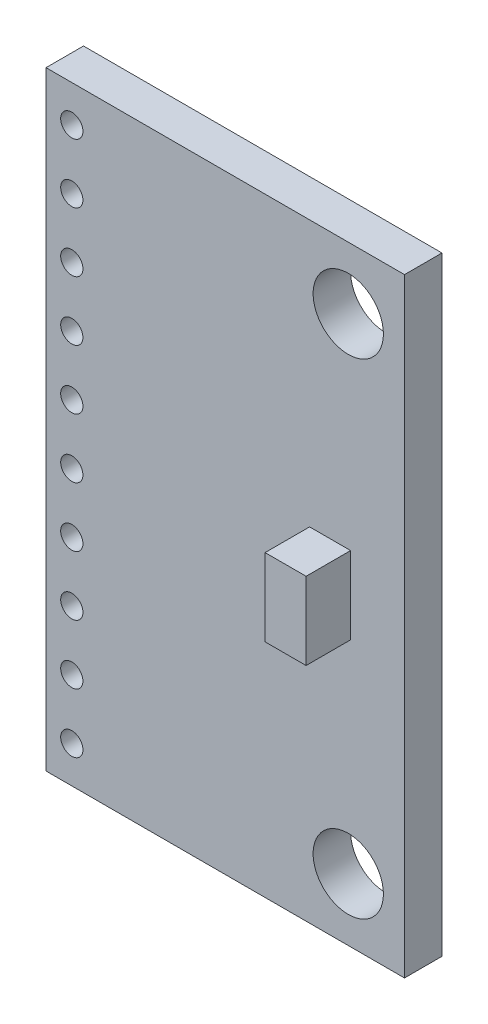
ISO-10303-21;
HEADER;
FILE_DESCRIPTION(('STEP AP214'),'2;1');
FILE_NAME('part.step','',(''),(''),'','','');
FILE_SCHEMA(('AUTOMOTIVE_DESIGN { 1 0 10303 214 1 1 1 1 }'));
ENDSEC;
DATA;
#1=APPLICATION_CONTEXT('core data for automotive mechanical design processes');
#2=APPLICATION_PROTOCOL_DEFINITION('international standard','automotive_design',2000,#1);
#3=PRODUCT_CONTEXT('',#1,'mechanical');
#4=PRODUCT('Part','Part','',(#3));
#5=PRODUCT_RELATED_PRODUCT_CATEGORY('part','',(#4));
#6=PRODUCT_DEFINITION_FORMATION('','',#4);
#7=PRODUCT_DEFINITION_CONTEXT('part definition',#1,'design');
#8=PRODUCT_DEFINITION('design','',#6,#7);
#9=PRODUCT_DEFINITION_SHAPE('','',#8);
#10=(LENGTH_UNIT() NAMED_UNIT(*) SI_UNIT(.MILLI.,.METRE.));
#11=(NAMED_UNIT(*) PLANE_ANGLE_UNIT() SI_UNIT($,.RADIAN.));
#12=(NAMED_UNIT(*) SI_UNIT($,.STERADIAN.) SOLID_ANGLE_UNIT());
#13=UNCERTAINTY_MEASURE_WITH_UNIT(LENGTH_MEASURE(1.E-05),#10,'distance_accuracy_value','');
#14=(GEOMETRIC_REPRESENTATION_CONTEXT(3) GLOBAL_UNCERTAINTY_ASSIGNED_CONTEXT((#13)) GLOBAL_UNIT_ASSIGNED_CONTEXT((#10,
#11,#12)) REPRESENTATION_CONTEXT('',''));
#15=CARTESIAN_POINT('',(0.,0.,0.));
#16=DIRECTION('',(0.,0.,1.));
#17=DIRECTION('',(1.,0.,0.));
#18=AXIS2_PLACEMENT_3D('',#15,#16,#17);
#19=CARTESIAN_POINT('',(0.,0.,0.));
#20=DIRECTION('',(0.,0.,1.));
#21=DIRECTION('',(1.,0.,0.));
#22=AXIS2_PLACEMENT_3D('',#19,#20,#21);
#23=PLANE('',#22);
#24=CARTESIAN_POINT('',(-6.55,-11.43,0.));
#25=DIRECTION('',(0.,0.,-1.));
#26=DIRECTION('',(1.,0.,0.));
#27=AXIS2_PLACEMENT_3D('',#24,#25,#26);
#28=CIRCLE('',#27,0.475);
#29=CARTESIAN_POINT('',(-6.075,-11.43,0.));
#30=VERTEX_POINT('',#29);
#31=EDGE_CURVE('E202',#30,#30,#28,.T.);
#32=ORIENTED_EDGE('',*,*,#31,.T.);
#33=EDGE_LOOP('',(#32));
#34=FACE_BOUND('',#33,.T.);
#35=CARTESIAN_POINT('',(-6.55,-6.35,0.));
#36=DIRECTION('',(0.,0.,-1.));
#37=DIRECTION('',(1.,0.,0.));
#38=AXIS2_PLACEMENT_3D('',#35,#36,#37);
#39=CIRCLE('',#38,0.475);
#40=CARTESIAN_POINT('',(-6.075,-6.35,0.));
#41=VERTEX_POINT('',#40);
#42=EDGE_CURVE('E210',#41,#41,#39,.T.);
#43=ORIENTED_EDGE('',*,*,#42,.T.);
#44=EDGE_LOOP('',(#43));
#45=FACE_BOUND('',#44,.T.);
#46=CARTESIAN_POINT('',(-6.55,3.81,0.));
#47=DIRECTION('',(0.,0.,1.));
#48=DIRECTION('',(1.,0.,0.));
#49=AXIS2_PLACEMENT_3D('',#46,#47,#48);
#50=CIRCLE('',#49,0.475);
#51=CARTESIAN_POINT('',(-6.075,3.81,0.));
#52=VERTEX_POINT('',#51);
#53=EDGE_CURVE('E219',#52,#52,#50,.T.);
#54=ORIENTED_EDGE('',*,*,#53,.F.);
#55=EDGE_LOOP('',(#54));
#56=FACE_BOUND('',#55,.T.);
#57=CARTESIAN_POINT('',(-6.55,6.35,0.));
#58=DIRECTION('',(0.,0.,1.));
#59=DIRECTION('',(1.,0.,0.));
#60=AXIS2_PLACEMENT_3D('',#57,#58,#59);
#61=CIRCLE('',#60,0.475);
#62=CARTESIAN_POINT('',(-6.075,6.35,0.));
#63=VERTEX_POINT('',#62);
#64=EDGE_CURVE('E227',#63,#63,#61,.T.);
#65=ORIENTED_EDGE('',*,*,#64,.F.);
#66=EDGE_LOOP('',(#65));
#67=FACE_BOUND('',#66,.T.);
#68=CARTESIAN_POINT('',(-6.55,8.89,0.));
#69=DIRECTION('',(0.,0.,1.));
#70=DIRECTION('',(1.,0.,0.));
#71=AXIS2_PLACEMENT_3D('',#68,#69,#70);
#72=CIRCLE('',#71,0.475);
#73=CARTESIAN_POINT('',(-6.075,8.89,0.));
#74=VERTEX_POINT('',#73);
#75=EDGE_CURVE('E233',#74,#74,#72,.T.);
#76=ORIENTED_EDGE('',*,*,#75,.F.);
#77=EDGE_LOOP('',(#76));
#78=FACE_BOUND('',#77,.T.);
#79=CARTESIAN_POINT('',(-6.55,11.43,0.));
#80=DIRECTION('',(0.,0.,1.));
#81=DIRECTION('',(1.,0.,0.));
#82=AXIS2_PLACEMENT_3D('',#79,#80,#81);
#83=CIRCLE('',#82,0.475);
#84=CARTESIAN_POINT('',(-6.075,11.43,0.));
#85=VERTEX_POINT('',#84);
#86=EDGE_CURVE('E217',#85,#85,#83,.T.);
#87=ORIENTED_EDGE('',*,*,#86,.F.);
#88=EDGE_LOOP('',(#87));
#89=FACE_BOUND('',#88,.T.);
#90=CARTESIAN_POINT('',(-6.55,1.27,0.));
#91=DIRECTION('',(0.,0.,1.));
#92=DIRECTION('',(1.,0.,0.));
#93=AXIS2_PLACEMENT_3D('',#90,#91,#92);
#94=CIRCLE('',#93,0.475);
#95=CARTESIAN_POINT('',(-6.075,1.27,0.));
#96=VERTEX_POINT('',#95);
#97=EDGE_CURVE('E243',#96,#96,#94,.T.);
#98=ORIENTED_EDGE('',*,*,#97,.F.);
#99=EDGE_LOOP('',(#98));
#100=FACE_BOUND('',#99,.T.);
#101=CARTESIAN_POINT('',(-6.55,-1.27,0.));
#102=DIRECTION('',(0.,0.,1.));
#103=DIRECTION('',(1.,0.,0.));
#104=AXIS2_PLACEMENT_3D('',#101,#102,#103);
#105=CIRCLE('',#104,0.475);
#106=CARTESIAN_POINT('',(-6.075,-1.27,0.));
#107=VERTEX_POINT('',#106);
#108=EDGE_CURVE('E226',#107,#107,#105,.T.);
#109=ORIENTED_EDGE('',*,*,#108,.F.);
#110=EDGE_LOOP('',(#109));
#111=FACE_BOUND('',#110,.T.);
#112=CARTESIAN_POINT('',(5.25000000000001,-10.35,0.));
#113=DIRECTION('',(0.,0.,1.));
#114=DIRECTION('',(1.,0.,0.));
#115=AXIS2_PLACEMENT_3D('',#112,#113,#114);
#116=CIRCLE('',#115,1.5);
#117=CARTESIAN_POINT('',(6.75000000000001,-10.35,0.));
#118=VERTEX_POINT('',#117);
#119=EDGE_CURVE('E140',#118,#118,#116,.T.);
#120=ORIENTED_EDGE('',*,*,#119,.F.);
#121=EDGE_LOOP('',(#120));
#122=FACE_BOUND('',#121,.T.);
#123=CARTESIAN_POINT('',(5.25000000000001,10.35,0.));
#124=DIRECTION('',(0.,0.,1.));
#125=DIRECTION('',(1.,0.,0.));
#126=AXIS2_PLACEMENT_3D('',#123,#124,#125);
#127=CIRCLE('',#126,1.5);
#128=CARTESIAN_POINT('',(6.75000000000001,10.35,0.));
#129=VERTEX_POINT('',#128);
#130=EDGE_CURVE('E132',#129,#129,#127,.T.);
#131=ORIENTED_EDGE('',*,*,#130,.F.);
#132=EDGE_LOOP('',(#131));
#133=FACE_BOUND('',#132,.T.);
#134=DIRECTION('',(0.,-1.,0.));
#135=VECTOR('',#134,1.);
#136=CARTESIAN_POINT('',(-7.65,13.,0.));
#137=LINE('',#136,#135);
#138=CARTESIAN_POINT('',(-7.65,13.,0.));
#139=VERTEX_POINT('',#138);
#140=CARTESIAN_POINT('',(-7.65,-13.,0.));
#141=VERTEX_POINT('',#140);
#142=EDGE_CURVE('E145',#139,#141,#137,.T.);
#143=ORIENTED_EDGE('',*,*,#142,.T.);
#144=DIRECTION('',(1.,0.,0.));
#145=VECTOR('',#144,1.);
#146=CARTESIAN_POINT('',(-7.65,-13.,0.));
#147=LINE('',#146,#145);
#148=CARTESIAN_POINT('',(7.65000000000001,-13.,0.));
#149=VERTEX_POINT('',#148);
#150=EDGE_CURVE('E161',#141,#149,#147,.T.);
#151=ORIENTED_EDGE('',*,*,#150,.T.);
#152=DIRECTION('',(0.,1.,0.));
#153=VECTOR('',#152,1.);
#154=CARTESIAN_POINT('',(7.65,13.,0.));
#155=LINE('',#154,#153);
#156=CARTESIAN_POINT('',(7.65,13.,0.));
#157=VERTEX_POINT('',#156);
#158=EDGE_CURVE('E164',#149,#157,#155,.T.);
#159=ORIENTED_EDGE('',*,*,#158,.T.);
#160=DIRECTION('',(-1.,0.,0.));
#161=VECTOR('',#160,1.);
#162=CARTESIAN_POINT('',(-7.65,13.,0.));
#163=LINE('',#162,#161);
#164=EDGE_CURVE('E152',#157,#139,#163,.T.);
#165=ORIENTED_EDGE('',*,*,#164,.T.);
#166=EDGE_LOOP('',(#143,#151,#159,#165));
#167=FACE_BOUND('',#166,.T.);
#168=DIRECTION('',(1.,0.,0.));
#169=VECTOR('',#168,1.);
#170=CARTESIAN_POINT('',(3.60000000000001,-1.65,0.));
#171=LINE('',#170,#169);
#172=CARTESIAN_POINT('',(3.60000000000001,-1.65,0.));
#173=VERTEX_POINT('',#172);
#174=CARTESIAN_POINT('',(5.35000000000001,-1.65,0.));
#175=VERTEX_POINT('',#174);
#176=EDGE_CURVE('E258',#173,#175,#171,.T.);
#177=ORIENTED_EDGE('',*,*,#176,.F.);
#178=DIRECTION('',(0.,-1.,0.));
#179=VECTOR('',#178,1.);
#180=CARTESIAN_POINT('',(3.60000000000001,1.65,0.));
#181=LINE('',#180,#179);
#182=CARTESIAN_POINT('',(3.60000000000001,1.65,0.));
#183=VERTEX_POINT('',#182);
#184=EDGE_CURVE('E130',#183,#173,#181,.T.);
#185=ORIENTED_EDGE('',*,*,#184,.F.);
#186=DIRECTION('',(-1.,0.,0.));
#187=VECTOR('',#186,1.);
#188=CARTESIAN_POINT('',(3.60000000000001,1.65,0.));
#189=LINE('',#188,#187);
#190=CARTESIAN_POINT('',(5.35000000000001,1.65,0.));
#191=VERTEX_POINT('',#190);
#192=EDGE_CURVE('E126',#191,#183,#189,.T.);
#193=ORIENTED_EDGE('',*,*,#192,.F.);
#194=DIRECTION('',(0.,1.,0.));
#195=VECTOR('',#194,1.);
#196=CARTESIAN_POINT('',(5.35000000000001,1.65,0.));
#197=LINE('',#196,#195);
#198=EDGE_CURVE('E260',#175,#191,#197,.T.);
#199=ORIENTED_EDGE('',*,*,#198,.F.);
#200=EDGE_LOOP('',(#177,#185,#193,#199));
#201=FACE_BOUND('',#200,.T.);
#202=CARTESIAN_POINT('',(-6.55,-3.81,0.));
#203=DIRECTION('',(0.,0.,-1.));
#204=DIRECTION('',(1.,0.,0.));
#205=AXIS2_PLACEMENT_3D('',#202,#203,#204);
#206=CIRCLE('',#205,0.475);
#207=CARTESIAN_POINT('',(-6.075,-3.81,0.));
#208=VERTEX_POINT('',#207);
#209=EDGE_CURVE('E214',#208,#208,#206,.T.);
#210=ORIENTED_EDGE('',*,*,#209,.T.);
#211=EDGE_LOOP('',(#210));
#212=FACE_BOUND('',#211,.T.);
#213=CARTESIAN_POINT('',(-6.55,-8.89,0.));
#214=DIRECTION('',(0.,0.,-1.));
#215=DIRECTION('',(1.,0.,0.));
#216=AXIS2_PLACEMENT_3D('',#213,#214,#215);
#217=CIRCLE('',#216,0.475);
#218=CARTESIAN_POINT('',(-6.075,-8.89,0.));
#219=VERTEX_POINT('',#218);
#220=EDGE_CURVE('E201',#219,#219,#217,.T.);
#221=ORIENTED_EDGE('',*,*,#220,.T.);
#222=EDGE_LOOP('',(#221));
#223=FACE_BOUND('',#222,.T.);
#224=ADVANCED_FACE('F34',(#34,#45,#56,#67,#78,#89,#100,#111,#122,#133,#167,#201,#212,#223),#23,.T.);
#225=CARTESIAN_POINT('',(0.,0.,-1.6));
#226=DIRECTION('',(0.,0.,1.));
#227=DIRECTION('',(1.,0.,0.));
#228=AXIS2_PLACEMENT_3D('',#225,#226,#227);
#229=PLANE('',#228);
#230=CARTESIAN_POINT('',(-6.55,3.81,-1.6));
#231=DIRECTION('',(0.,0.,1.));
#232=DIRECTION('',(1.,0.,0.));
#233=AXIS2_PLACEMENT_3D('',#230,#231,#232);
#234=CIRCLE('',#233,0.475);
#235=CARTESIAN_POINT('',(-6.075,3.81,-1.6));
#236=VERTEX_POINT('',#235);
#237=EDGE_CURVE('E222',#236,#236,#234,.F.);
#238=ORIENTED_EDGE('',*,*,#237,.F.);
#239=EDGE_LOOP('',(#238));
#240=FACE_BOUND('',#239,.T.);
#241=CARTESIAN_POINT('',(-6.55,6.35,-1.6));
#242=DIRECTION('',(0.,0.,1.));
#243=DIRECTION('',(1.,0.,0.));
#244=AXIS2_PLACEMENT_3D('',#241,#242,#243);
#245=CIRCLE('',#244,0.475);
#246=CARTESIAN_POINT('',(-6.075,6.35,-1.6));
#247=VERTEX_POINT('',#246);
#248=EDGE_CURVE('E223',#247,#247,#245,.F.);
#249=ORIENTED_EDGE('',*,*,#248,.F.);
#250=EDGE_LOOP('',(#249));
#251=FACE_BOUND('',#250,.T.);
#252=CARTESIAN_POINT('',(-6.55,8.89,-1.6));
#253=DIRECTION('',(0.,0.,1.));
#254=DIRECTION('',(1.,0.,0.));
#255=AXIS2_PLACEMENT_3D('',#252,#253,#254);
#256=CIRCLE('',#255,0.475);
#257=CARTESIAN_POINT('',(-6.075,8.89,-1.6));
#258=VERTEX_POINT('',#257);
#259=EDGE_CURVE('E230',#258,#258,#256,.F.);
#260=ORIENTED_EDGE('',*,*,#259,.F.);
#261=EDGE_LOOP('',(#260));
#262=FACE_BOUND('',#261,.T.);
#263=CARTESIAN_POINT('',(-6.55,11.43,-1.6));
#264=DIRECTION('',(0.,0.,1.));
#265=DIRECTION('',(1.,0.,0.));
#266=AXIS2_PLACEMENT_3D('',#263,#264,#265);
#267=CIRCLE('',#266,0.475);
#268=CARTESIAN_POINT('',(-6.075,11.43,-1.6));
#269=VERTEX_POINT('',#268);
#270=EDGE_CURVE('E236',#269,#269,#267,.F.);
#271=ORIENTED_EDGE('',*,*,#270,.F.);
#272=EDGE_LOOP('',(#271));
#273=FACE_BOUND('',#272,.T.);
#274=CARTESIAN_POINT('',(-6.55,1.27,-1.6));
#275=DIRECTION('',(0.,0.,1.));
#276=DIRECTION('',(1.,0.,0.));
#277=AXIS2_PLACEMENT_3D('',#274,#275,#276);
#278=CIRCLE('',#277,0.475);
#279=CARTESIAN_POINT('',(-6.075,1.27,-1.6));
#280=VERTEX_POINT('',#279);
#281=EDGE_CURVE('E246',#280,#280,#278,.F.);
#282=ORIENTED_EDGE('',*,*,#281,.F.);
#283=EDGE_LOOP('',(#282));
#284=FACE_BOUND('',#283,.T.);
#285=CARTESIAN_POINT('',(-6.55,-1.27,-1.6));
#286=DIRECTION('',(0.,0.,1.));
#287=DIRECTION('',(1.,0.,0.));
#288=AXIS2_PLACEMENT_3D('',#285,#286,#287);
#289=CIRCLE('',#288,0.475);
#290=CARTESIAN_POINT('',(-6.075,-1.27,-1.6));
#291=VERTEX_POINT('',#290);
#292=EDGE_CURVE('E247',#291,#291,#289,.F.);
#293=ORIENTED_EDGE('',*,*,#292,.F.);
#294=EDGE_LOOP('',(#293));
#295=FACE_BOUND('',#294,.T.);
#296=CARTESIAN_POINT('',(5.25000000000001,-10.35,-1.6));
#297=DIRECTION('',(0.,0.,1.));
#298=DIRECTION('',(1.,0.,0.));
#299=AXIS2_PLACEMENT_3D('',#296,#297,#298);
#300=CIRCLE('',#299,1.5);
#301=CARTESIAN_POINT('',(6.75000000000001,-10.35,-1.6));
#302=VERTEX_POINT('',#301);
#303=EDGE_CURVE('E143',#302,#302,#300,.F.);
#304=ORIENTED_EDGE('',*,*,#303,.F.);
#305=EDGE_LOOP('',(#304));
#306=FACE_BOUND('',#305,.T.);
#307=CARTESIAN_POINT('',(5.25000000000001,10.35,-1.6));
#308=DIRECTION('',(0.,0.,1.));
#309=DIRECTION('',(1.,0.,0.));
#310=AXIS2_PLACEMENT_3D('',#307,#308,#309);
#311=CIRCLE('',#310,1.5);
#312=CARTESIAN_POINT('',(6.75000000000001,10.35,-1.6));
#313=VERTEX_POINT('',#312);
#314=EDGE_CURVE('E135',#313,#313,#311,.F.);
#315=ORIENTED_EDGE('',*,*,#314,.F.);
#316=EDGE_LOOP('',(#315));
#317=FACE_BOUND('',#316,.T.);
#318=DIRECTION('',(0.,-1.,0.));
#319=VECTOR('',#318,1.);
#320=CARTESIAN_POINT('',(-7.65,13.,-1.6));
#321=LINE('',#320,#319);
#322=CARTESIAN_POINT('',(-7.65,13.,-1.6));
#323=VERTEX_POINT('',#322);
#324=CARTESIAN_POINT('',(-7.65,-13.,-1.6));
#325=VERTEX_POINT('',#324);
#326=EDGE_CURVE('E149',#323,#325,#321,.T.);
#327=ORIENTED_EDGE('',*,*,#326,.F.);
#328=DIRECTION('',(-1.,0.,0.));
#329=VECTOR('',#328,1.);
#330=CARTESIAN_POINT('',(-7.65,13.,-1.6));
#331=LINE('',#330,#329);
#332=CARTESIAN_POINT('',(7.65,13.,-1.6));
#333=VERTEX_POINT('',#332);
#334=EDGE_CURVE('E157',#333,#323,#331,.T.);
#335=ORIENTED_EDGE('',*,*,#334,.F.);
#336=DIRECTION('',(0.,1.,0.));
#337=VECTOR('',#336,1.);
#338=CARTESIAN_POINT('',(7.65,13.,-1.6));
#339=LINE('',#338,#337);
#340=CARTESIAN_POINT('',(7.65000000000001,-13.,-1.6));
#341=VERTEX_POINT('',#340);
#342=EDGE_CURVE('E154',#341,#333,#339,.T.);
#343=ORIENTED_EDGE('',*,*,#342,.F.);
#344=DIRECTION('',(1.,0.,0.));
#345=VECTOR('',#344,1.);
#346=CARTESIAN_POINT('',(-7.65,-13.,-1.6));
#347=LINE('',#346,#345);
#348=EDGE_CURVE('E151',#325,#341,#347,.T.);
#349=ORIENTED_EDGE('',*,*,#348,.F.);
#350=EDGE_LOOP('',(#327,#335,#343,#349));
#351=FACE_BOUND('',#350,.T.);
#352=CARTESIAN_POINT('',(-6.55,-6.35,-1.6));
#353=DIRECTION('',(0.,0.,1.));
#354=DIRECTION('',(1.,0.,0.));
#355=AXIS2_PLACEMENT_3D('',#352,#353,#354);
#356=CIRCLE('',#355,0.475);
#357=CARTESIAN_POINT('',(-6.075,-6.35,-1.6));
#358=VERTEX_POINT('',#357);
#359=EDGE_CURVE('E188',#358,#358,#356,.T.);
#360=ORIENTED_EDGE('',*,*,#359,.T.);
#361=EDGE_LOOP('',(#360));
#362=FACE_BOUND('',#361,.T.);
#363=CARTESIAN_POINT('',(-6.55,-3.81,-1.6));
#364=DIRECTION('',(0.,0.,1.));
#365=DIRECTION('',(1.,0.,0.));
#366=AXIS2_PLACEMENT_3D('',#363,#364,#365);
#367=CIRCLE('',#366,0.475);
#368=CARTESIAN_POINT('',(-6.075,-3.81,-1.6));
#369=VERTEX_POINT('',#368);
#370=EDGE_CURVE('E192',#369,#369,#367,.T.);
#371=ORIENTED_EDGE('',*,*,#370,.T.);
#372=EDGE_LOOP('',(#371));
#373=FACE_BOUND('',#372,.T.);
#374=CARTESIAN_POINT('',(-6.55,-11.43,-1.6));
#375=DIRECTION('',(0.,0.,1.));
#376=DIRECTION('',(1.,0.,0.));
#377=AXIS2_PLACEMENT_3D('',#374,#375,#376);
#378=CIRCLE('',#377,0.475);
#379=CARTESIAN_POINT('',(-6.075,-11.43,-1.6));
#380=VERTEX_POINT('',#379);
#381=EDGE_CURVE('E196',#380,#380,#378,.T.);
#382=ORIENTED_EDGE('',*,*,#381,.T.);
#383=EDGE_LOOP('',(#382));
#384=FACE_BOUND('',#383,.T.);
#385=CARTESIAN_POINT('',(-6.55,-8.89,-1.6));
#386=DIRECTION('',(0.,0.,1.));
#387=DIRECTION('',(1.,0.,0.));
#388=AXIS2_PLACEMENT_3D('',#385,#386,#387);
#389=CIRCLE('',#388,0.475);
#390=CARTESIAN_POINT('',(-6.075,-8.89,-1.6));
#391=VERTEX_POINT('',#390);
#392=EDGE_CURVE('E199',#391,#391,#389,.T.);
#393=ORIENTED_EDGE('',*,*,#392,.T.);
#394=EDGE_LOOP('',(#393));
#395=FACE_BOUND('',#394,.T.);
#396=ADVANCED_FACE('F180',(#240,#251,#262,#273,#284,#295,#306,#317,#351,#362,#373,#384,#395),
#229,.F.);
#397=CARTESIAN_POINT('',(-7.65,13.,-1.6));
#398=DIRECTION('',(-1.,0.,0.));
#399=DIRECTION('',(0.,-1.,0.));
#400=AXIS2_PLACEMENT_3D('',#397,#398,#399);
#401=PLANE('',#400);
#402=ORIENTED_EDGE('',*,*,#142,.F.);
#403=DIRECTION('',(0.,0.,1.));
#404=VECTOR('',#403,1.);
#405=CARTESIAN_POINT('',(-7.65,13.,-1.6));
#406=LINE('',#405,#404);
#407=EDGE_CURVE('E11',#323,#139,#406,.T.);
#408=ORIENTED_EDGE('',*,*,#407,.F.);
#409=ORIENTED_EDGE('',*,*,#326,.T.);
#410=DIRECTION('',(0.,0.,1.));
#411=VECTOR('',#410,1.);
#412=CARTESIAN_POINT('',(-7.65,-13.,-1.6));
#413=LINE('',#412,#411);
#414=EDGE_CURVE('E38',#325,#141,#413,.T.);
#415=ORIENTED_EDGE('',*,*,#414,.T.);
#416=EDGE_LOOP('',(#402,#408,#409,#415));
#417=FACE_BOUND('',#416,.T.);
#418=ADVANCED_FACE('F36',(#417),#401,.T.);
#419=CARTESIAN_POINT('',(-7.65,13.,-1.6));
#420=DIRECTION('',(0.,1.,0.));
#421=DIRECTION('',(-1.,0.,0.));
#422=AXIS2_PLACEMENT_3D('',#419,#420,#421);
#423=PLANE('',#422);
#424=ORIENTED_EDGE('',*,*,#164,.F.);
#425=DIRECTION('',(0.,0.,1.));
#426=VECTOR('',#425,1.);
#427=CARTESIAN_POINT('',(7.65,13.,-1.6));
#428=LINE('',#427,#426);
#429=EDGE_CURVE('E43',#333,#157,#428,.T.);
#430=ORIENTED_EDGE('',*,*,#429,.F.);
#431=ORIENTED_EDGE('',*,*,#334,.T.);
#432=ORIENTED_EDGE('',*,*,#407,.T.);
#433=EDGE_LOOP('',(#424,#430,#431,#432));
#434=FACE_BOUND('',#433,.T.);
#435=ADVANCED_FACE('F174',(#434),#423,.T.);
#436=CARTESIAN_POINT('',(7.65,13.,-1.6));
#437=DIRECTION('',(1.,0.,0.));
#438=DIRECTION('',(0.,1.,0.));
#439=AXIS2_PLACEMENT_3D('',#436,#437,#438);
#440=PLANE('',#439);
#441=ORIENTED_EDGE('',*,*,#158,.F.);
#442=DIRECTION('',(0.,0.,1.));
#443=VECTOR('',#442,1.);
#444=CARTESIAN_POINT('',(7.65000000000001,-13.,-1.6));
#445=LINE('',#444,#443);
#446=EDGE_CURVE('E169',#341,#149,#445,.T.);
#447=ORIENTED_EDGE('',*,*,#446,.F.);
#448=ORIENTED_EDGE('',*,*,#342,.T.);
#449=ORIENTED_EDGE('',*,*,#429,.T.);
#450=EDGE_LOOP('',(#441,#447,#448,#449));
#451=FACE_BOUND('',#450,.T.);
#452=ADVANCED_FACE('F178',(#451),#440,.T.);
#453=CARTESIAN_POINT('',(-7.65,-13.,-1.6));
#454=DIRECTION('',(0.,-1.,0.));
#455=DIRECTION('',(1.,0.,0.));
#456=AXIS2_PLACEMENT_3D('',#453,#454,#455);
#457=PLANE('',#456);
#458=ORIENTED_EDGE('',*,*,#150,.F.);
#459=ORIENTED_EDGE('',*,*,#414,.F.);
#460=ORIENTED_EDGE('',*,*,#348,.T.);
#461=ORIENTED_EDGE('',*,*,#446,.T.);
#462=EDGE_LOOP('',(#458,#459,#460,#461));
#463=FACE_BOUND('',#462,.T.);
#464=ADVANCED_FACE('F171',(#463),#457,.T.);
#465=CARTESIAN_POINT('',(5.25000000000001,10.35,-1.601));
#466=DIRECTION('',(0.,0.,1.));
#467=DIRECTION('',(1.,0.,0.));
#468=AXIS2_PLACEMENT_3D('',#465,#466,#467);
#469=CYLINDRICAL_SURFACE('',#468,1.5);
#470=ORIENTED_EDGE('',*,*,#130,.T.);
#471=EDGE_LOOP('',(#470));
#472=FACE_BOUND('',#471,.T.);
#473=ORIENTED_EDGE('',*,*,#314,.T.);
#474=EDGE_LOOP('',(#473));
#475=FACE_BOUND('',#474,.T.);
#476=ADVANCED_FACE('F290',(#472,#475),#469,.F.);
#477=CARTESIAN_POINT('',(5.25000000000001,-10.35,-1.601));
#478=DIRECTION('',(0.,0.,1.));
#479=DIRECTION('',(1.,0.,0.));
#480=AXIS2_PLACEMENT_3D('',#477,#478,#479);
#481=CYLINDRICAL_SURFACE('',#480,1.5);
#482=ORIENTED_EDGE('',*,*,#119,.T.);
#483=EDGE_LOOP('',(#482));
#484=FACE_BOUND('',#483,.T.);
#485=ORIENTED_EDGE('',*,*,#303,.T.);
#486=EDGE_LOOP('',(#485));
#487=FACE_BOUND('',#486,.T.);
#488=ADVANCED_FACE('F294',(#484,#487),#481,.F.);
#489=CARTESIAN_POINT('',(3.60000000000001,1.65,1.9));
#490=DIRECTION('',(1.,0.,0.));
#491=DIRECTION('',(0.,0.,-1.));
#492=AXIS2_PLACEMENT_3D('',#489,#490,#491);
#493=PLANE('',#492);
#494=ORIENTED_EDGE('',*,*,#184,.T.);
#495=DIRECTION('',(0.,0.,-1.));
#496=VECTOR('',#495,1.);
#497=CARTESIAN_POINT('',(3.60000000000001,-1.65,1.9));
#498=LINE('',#497,#496);
#499=CARTESIAN_POINT('',(3.60000000000001,-1.65,1.9));
#500=VERTEX_POINT('',#499);
#501=EDGE_CURVE('E111',#500,#173,#498,.T.);
#502=ORIENTED_EDGE('',*,*,#501,.F.);
#503=DIRECTION('',(0.,-1.,0.));
#504=VECTOR('',#503,1.);
#505=CARTESIAN_POINT('',(3.60000000000001,1.65,1.9));
#506=LINE('',#505,#504);
#507=CARTESIAN_POINT('',(3.60000000000001,1.65,1.9));
#508=VERTEX_POINT('',#507);
#509=EDGE_CURVE('E118',#508,#500,#506,.T.);
#510=ORIENTED_EDGE('',*,*,#509,.F.);
#511=DIRECTION('',(0.,0.,-1.));
#512=VECTOR('',#511,1.);
#513=CARTESIAN_POINT('',(3.60000000000001,1.65,1.9));
#514=LINE('',#513,#512);
#515=EDGE_CURVE('E256',#508,#183,#514,.T.);
#516=ORIENTED_EDGE('',*,*,#515,.T.);
#517=EDGE_LOOP('',(#494,#502,#510,#516));
#518=FACE_BOUND('',#517,.T.);
#519=ADVANCED_FACE('F128',(#518),#493,.F.);
#520=CARTESIAN_POINT('',(3.60000000000001,-1.65,1.9));
#521=DIRECTION('',(0.,1.,0.));
#522=DIRECTION('',(0.,0.,1.));
#523=AXIS2_PLACEMENT_3D('',#520,#521,#522);
#524=PLANE('',#523);
#525=ORIENTED_EDGE('',*,*,#176,.T.);
#526=DIRECTION('',(0.,0.,-1.));
#527=VECTOR('',#526,1.);
#528=CARTESIAN_POINT('',(5.35000000000001,-1.65,1.9));
#529=LINE('',#528,#527);
#530=CARTESIAN_POINT('',(5.35000000000001,-1.65,1.9));
#531=VERTEX_POINT('',#530);
#532=EDGE_CURVE('E114',#531,#175,#529,.T.);
#533=ORIENTED_EDGE('',*,*,#532,.F.);
#534=DIRECTION('',(1.,0.,0.));
#535=VECTOR('',#534,1.);
#536=CARTESIAN_POINT('',(3.60000000000001,-1.65,1.9));
#537=LINE('',#536,#535);
#538=EDGE_CURVE('E107',#500,#531,#537,.T.);
#539=ORIENTED_EDGE('',*,*,#538,.F.);
#540=ORIENTED_EDGE('',*,*,#501,.T.);
#541=EDGE_LOOP('',(#525,#533,#539,#540));
#542=FACE_BOUND('',#541,.T.);
#543=ADVANCED_FACE('F109',(#542),#524,.F.);
#544=CARTESIAN_POINT('',(5.35000000000001,1.65,1.9));
#545=DIRECTION('',(-1.,0.,0.));
#546=DIRECTION('',(0.,0.,1.));
#547=AXIS2_PLACEMENT_3D('',#544,#545,#546);
#548=PLANE('',#547);
#549=ORIENTED_EDGE('',*,*,#198,.T.);
#550=DIRECTION('',(0.,0.,-1.));
#551=VECTOR('',#550,1.);
#552=CARTESIAN_POINT('',(5.35000000000001,1.65,1.9));
#553=LINE('',#552,#551);
#554=CARTESIAN_POINT('',(5.35000000000001,1.65,1.9));
#555=VERTEX_POINT('',#554);
#556=EDGE_CURVE('E51',#555,#191,#553,.T.);
#557=ORIENTED_EDGE('',*,*,#556,.F.);
#558=DIRECTION('',(0.,1.,0.));
#559=VECTOR('',#558,1.);
#560=CARTESIAN_POINT('',(5.35000000000001,1.65,1.9));
#561=LINE('',#560,#559);
#562=EDGE_CURVE('E117',#531,#555,#561,.T.);
#563=ORIENTED_EDGE('',*,*,#562,.F.);
#564=ORIENTED_EDGE('',*,*,#532,.T.);
#565=EDGE_LOOP('',(#549,#557,#563,#564));
#566=FACE_BOUND('',#565,.T.);
#567=ADVANCED_FACE('F267',(#566),#548,.F.);
#568=CARTESIAN_POINT('',(3.60000000000001,1.65,1.9));
#569=DIRECTION('',(0.,-1.,0.));
#570=DIRECTION('',(0.,0.,-1.));
#571=AXIS2_PLACEMENT_3D('',#568,#569,#570);
#572=PLANE('',#571);
#573=ORIENTED_EDGE('',*,*,#192,.T.);
#574=ORIENTED_EDGE('',*,*,#515,.F.);
#575=DIRECTION('',(-1.,0.,0.));
#576=VECTOR('',#575,1.);
#577=CARTESIAN_POINT('',(3.60000000000001,1.65,1.9));
#578=LINE('',#577,#576);
#579=EDGE_CURVE('E122',#555,#508,#578,.T.);
#580=ORIENTED_EDGE('',*,*,#579,.F.);
#581=ORIENTED_EDGE('',*,*,#556,.T.);
#582=EDGE_LOOP('',(#573,#574,#580,#581));
#583=FACE_BOUND('',#582,.T.);
#584=ADVANCED_FACE('F268',(#583),#572,.F.);
#585=CARTESIAN_POINT('',(0.,0.,1.9));
#586=DIRECTION('',(0.,0.,1.));
#587=DIRECTION('',(1.,0.,0.));
#588=AXIS2_PLACEMENT_3D('',#585,#586,#587);
#589=PLANE('',#588);
#590=ORIENTED_EDGE('',*,*,#509,.T.);
#591=ORIENTED_EDGE('',*,*,#538,.T.);
#592=ORIENTED_EDGE('',*,*,#562,.T.);
#593=ORIENTED_EDGE('',*,*,#579,.T.);
#594=EDGE_LOOP('',(#590,#591,#592,#593));
#595=FACE_BOUND('',#594,.T.);
#596=ADVANCED_FACE('F121',(#595),#589,.T.);
#597=CARTESIAN_POINT('',(-6.55,-1.27,-1.601));
#598=DIRECTION('',(0.,0.,1.));
#599=DIRECTION('',(1.,0.,0.));
#600=AXIS2_PLACEMENT_3D('',#597,#598,#599);
#601=CYLINDRICAL_SURFACE('',#600,0.475);
#602=ORIENTED_EDGE('',*,*,#108,.T.);
#603=EDGE_LOOP('',(#602));
#604=FACE_BOUND('',#603,.T.);
#605=ORIENTED_EDGE('',*,*,#292,.T.);
#606=EDGE_LOOP('',(#605));
#607=FACE_BOUND('',#606,.T.);
#608=ADVANCED_FACE('F275',(#604,#607),#601,.F.);
#609=CARTESIAN_POINT('',(-6.55,1.27,-1.601));
#610=DIRECTION('',(0.,0.,1.));
#611=DIRECTION('',(1.,0.,0.));
#612=AXIS2_PLACEMENT_3D('',#609,#610,#611);
#613=CYLINDRICAL_SURFACE('',#612,0.475);
#614=ORIENTED_EDGE('',*,*,#97,.T.);
#615=EDGE_LOOP('',(#614));
#616=FACE_BOUND('',#615,.T.);
#617=ORIENTED_EDGE('',*,*,#281,.T.);
#618=EDGE_LOOP('',(#617));
#619=FACE_BOUND('',#618,.T.);
#620=ADVANCED_FACE('F333',(#616,#619),#613,.F.);
#621=CARTESIAN_POINT('',(-6.55,11.43,-1.601));
#622=DIRECTION('',(0.,0.,1.));
#623=DIRECTION('',(1.,0.,0.));
#624=AXIS2_PLACEMENT_3D('',#621,#622,#623);
#625=CYLINDRICAL_SURFACE('',#624,0.475);
#626=ORIENTED_EDGE('',*,*,#86,.T.);
#627=EDGE_LOOP('',(#626));
#628=FACE_BOUND('',#627,.T.);
#629=ORIENTED_EDGE('',*,*,#270,.T.);
#630=EDGE_LOOP('',(#629));
#631=FACE_BOUND('',#630,.T.);
#632=ADVANCED_FACE('F343',(#628,#631),#625,.F.);
#633=CARTESIAN_POINT('',(-6.55,8.89,-1.601));
#634=DIRECTION('',(0.,0.,1.));
#635=DIRECTION('',(1.,0.,0.));
#636=AXIS2_PLACEMENT_3D('',#633,#634,#635);
#637=CYLINDRICAL_SURFACE('',#636,0.475);
#638=ORIENTED_EDGE('',*,*,#75,.T.);
#639=EDGE_LOOP('',(#638));
#640=FACE_BOUND('',#639,.T.);
#641=ORIENTED_EDGE('',*,*,#259,.T.);
#642=EDGE_LOOP('',(#641));
#643=FACE_BOUND('',#642,.T.);
#644=ADVANCED_FACE('F353',(#640,#643),#637,.F.);
#645=CARTESIAN_POINT('',(-6.55,6.35,-1.601));
#646=DIRECTION('',(0.,0.,1.));
#647=DIRECTION('',(1.,0.,0.));
#648=AXIS2_PLACEMENT_3D('',#645,#646,#647);
#649=CYLINDRICAL_SURFACE('',#648,0.475);
#650=ORIENTED_EDGE('',*,*,#64,.T.);
#651=EDGE_LOOP('',(#650));
#652=FACE_BOUND('',#651,.T.);
#653=ORIENTED_EDGE('',*,*,#248,.T.);
#654=EDGE_LOOP('',(#653));
#655=FACE_BOUND('',#654,.T.);
#656=ADVANCED_FACE('F363',(#652,#655),#649,.F.);
#657=CARTESIAN_POINT('',(-6.55,3.81,-1.601));
#658=DIRECTION('',(0.,0.,1.));
#659=DIRECTION('',(1.,0.,0.));
#660=AXIS2_PLACEMENT_3D('',#657,#658,#659);
#661=CYLINDRICAL_SURFACE('',#660,0.475);
#662=ORIENTED_EDGE('',*,*,#53,.T.);
#663=EDGE_LOOP('',(#662));
#664=FACE_BOUND('',#663,.T.);
#665=ORIENTED_EDGE('',*,*,#237,.T.);
#666=EDGE_LOOP('',(#665));
#667=FACE_BOUND('',#666,.T.);
#668=ADVANCED_FACE('F373',(#664,#667),#661,.F.);
#669=CARTESIAN_POINT('',(-6.55,-6.35,-1.601));
#670=DIRECTION('',(0.,0.,1.));
#671=DIRECTION('',(1.,0.,0.));
#672=AXIS2_PLACEMENT_3D('',#669,#670,#671);
#673=CYLINDRICAL_SURFACE('',#672,0.475);
#674=ORIENTED_EDGE('',*,*,#42,.F.);
#675=EDGE_LOOP('',(#674));
#676=FACE_BOUND('',#675,.T.);
#677=ORIENTED_EDGE('',*,*,#359,.F.);
#678=EDGE_LOOP('',(#677));
#679=FACE_BOUND('',#678,.T.);
#680=ADVANCED_FACE('F382',(#676,#679),#673,.F.);
#681=CARTESIAN_POINT('',(-6.55,-3.81,-1.601));
#682=DIRECTION('',(0.,0.,1.));
#683=DIRECTION('',(1.,0.,0.));
#684=AXIS2_PLACEMENT_3D('',#681,#682,#683);
#685=CYLINDRICAL_SURFACE('',#684,0.475);
#686=ORIENTED_EDGE('',*,*,#209,.F.);
#687=EDGE_LOOP('',(#686));
#688=FACE_BOUND('',#687,.T.);
#689=ORIENTED_EDGE('',*,*,#370,.F.);
#690=EDGE_LOOP('',(#689));
#691=FACE_BOUND('',#690,.T.);
#692=ADVANCED_FACE('F403',(#688,#691),#685,.F.);
#693=CARTESIAN_POINT('',(-6.55,-11.43,-1.601));
#694=DIRECTION('',(0.,0.,1.));
#695=DIRECTION('',(1.,0.,0.));
#696=AXIS2_PLACEMENT_3D('',#693,#694,#695);
#697=CYLINDRICAL_SURFACE('',#696,0.475);
#698=ORIENTED_EDGE('',*,*,#31,.F.);
#699=EDGE_LOOP('',(#698));
#700=FACE_BOUND('',#699,.T.);
#701=ORIENTED_EDGE('',*,*,#381,.F.);
#702=EDGE_LOOP('',(#701));
#703=FACE_BOUND('',#702,.T.);
#704=ADVANCED_FACE('F413',(#700,#703),#697,.F.);
#705=CARTESIAN_POINT('',(-6.55,-8.89,-1.601));
#706=DIRECTION('',(0.,0.,1.));
#707=DIRECTION('',(1.,0.,0.));
#708=AXIS2_PLACEMENT_3D('',#705,#706,#707);
#709=CYLINDRICAL_SURFACE('',#708,0.475);
#710=ORIENTED_EDGE('',*,*,#220,.F.);
#711=EDGE_LOOP('',(#710));
#712=FACE_BOUND('',#711,.T.);
#713=ORIENTED_EDGE('',*,*,#392,.F.);
#714=EDGE_LOOP('',(#713));
#715=FACE_BOUND('',#714,.T.);
#716=ADVANCED_FACE('F423',(#712,#715),#709,.F.);
#717=CLOSED_SHELL('',(#224,#396,#418,#435,#452,#464,#476,#488,#519,#543,#567,#584,#596,#608,
#620,#632,#644,#656,#668,#680,#692,#704,#716));
#718=MANIFOLD_SOLID_BREP('B2',#717);
#719=ADVANCED_BREP_SHAPE_REPRESENTATION('',(#18,#718),#14);
#720=SHAPE_DEFINITION_REPRESENTATION(#9,#719);
ENDSEC;
END-ISO-10303-21;
